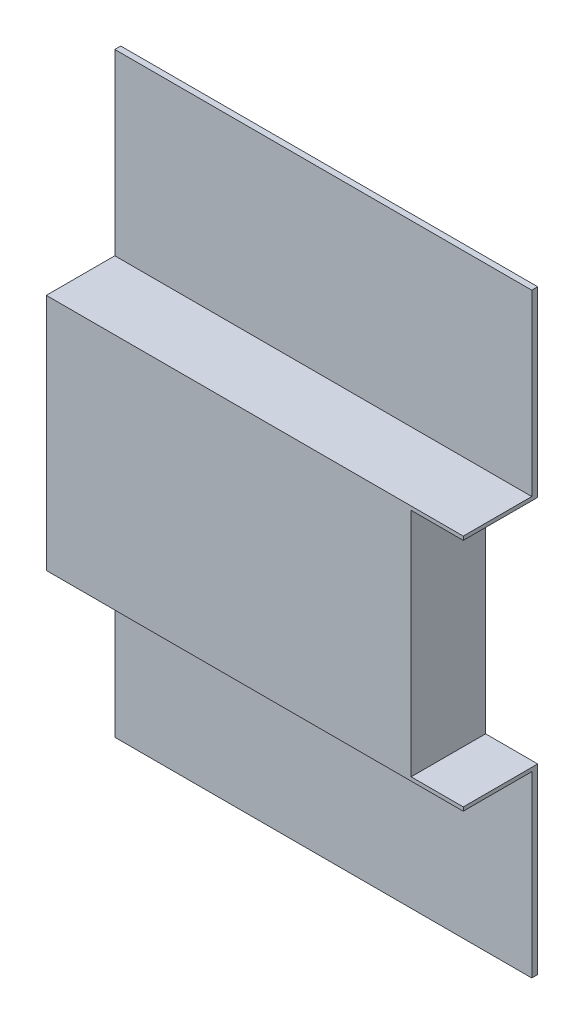
ISO-10303-21;
HEADER;
FILE_DESCRIPTION(('STEP AP214'),'2;1');
FILE_NAME('part.step','',(''),(''),'','','');
FILE_SCHEMA(('AUTOMOTIVE_DESIGN { 1 0 10303 214 1 1 1 1 }'));
ENDSEC;
DATA;
#1=APPLICATION_CONTEXT('core data for automotive mechanical design processes');
#2=APPLICATION_PROTOCOL_DEFINITION('international standard','automotive_design',2000,#1);
#3=PRODUCT_CONTEXT('',#1,'mechanical');
#4=PRODUCT('Part','Part','',(#3));
#5=PRODUCT_RELATED_PRODUCT_CATEGORY('part','',(#4));
#6=PRODUCT_DEFINITION_FORMATION('','',#4);
#7=PRODUCT_DEFINITION_CONTEXT('part definition',#1,'design');
#8=PRODUCT_DEFINITION('design','',#6,#7);
#9=PRODUCT_DEFINITION_SHAPE('','',#8);
#10=(LENGTH_UNIT() NAMED_UNIT(*) SI_UNIT(.MILLI.,.METRE.));
#11=(NAMED_UNIT(*) PLANE_ANGLE_UNIT() SI_UNIT($,.RADIAN.));
#12=(NAMED_UNIT(*) SI_UNIT($,.STERADIAN.) SOLID_ANGLE_UNIT());
#13=UNCERTAINTY_MEASURE_WITH_UNIT(LENGTH_MEASURE(1.E-05),#10,'distance_accuracy_value','');
#14=(GEOMETRIC_REPRESENTATION_CONTEXT(3) GLOBAL_UNCERTAINTY_ASSIGNED_CONTEXT((#13)) GLOBAL_UNIT_ASSIGNED_CONTEXT((#10,
#11,#12)) REPRESENTATION_CONTEXT('',''));
#15=CARTESIAN_POINT('',(0.,0.,0.));
#16=DIRECTION('',(0.,0.,1.));
#17=DIRECTION('',(1.,0.,0.));
#18=AXIS2_PLACEMENT_3D('',#15,#16,#17);
#19=CARTESIAN_POINT('',(2.65,0.4,0.25));
#20=DIRECTION('',(0.,1.,0.));
#21=DIRECTION('',(0.,0.,1.));
#22=AXIS2_PLACEMENT_3D('',#19,#20,#21);
#23=PLANE('',#22);
#24=DIRECTION('',(0.,0.,1.));
#25=VECTOR('',#24,1.);
#26=CARTESIAN_POINT('',(2.6,0.4,0.25));
#27=LINE('',#26,#25);
#28=CARTESIAN_POINT('',(2.6,0.4000000015625,0.25));
#29=VERTEX_POINT('',#28);
#30=CARTESIAN_POINT('',(2.6,0.4,0.01999998645267));
#31=VERTEX_POINT('',#30);
#32=EDGE_CURVE('E116',#29,#31,#27,.F.);
#33=ORIENTED_EDGE('',*,*,#32,.T.);
#34=DIRECTION('',(1.,0.,0.));
#35=VECTOR('',#34,1.);
#36=CARTESIAN_POINT('',(0.,0.4,0.0199999958276701));
#37=LINE('',#36,#35);
#38=CARTESIAN_POINT('',(1.2,0.4,0.01999998957767));
#39=VERTEX_POINT('',#38);
#40=EDGE_CURVE('E121',#31,#39,#37,.F.);
#41=ORIENTED_EDGE('',*,*,#40,.T.);
#42=DIRECTION('',(0.,0.,1.));
#43=VECTOR('',#42,1.);
#44=CARTESIAN_POINT('',(1.2,0.4,0.25));
#45=LINE('',#44,#43);
#46=CARTESIAN_POINT('',(1.2,0.4000000015625,0.25));
#47=VERTEX_POINT('',#46);
#48=EDGE_CURVE('E20',#39,#47,#45,.T.);
#49=ORIENTED_EDGE('',*,*,#48,.T.);
#50=DIRECTION('',(1.,0.,0.));
#51=VECTOR('',#50,1.);
#52=CARTESIAN_POINT('',(2.6,0.40000000625,0.25));
#53=LINE('',#52,#51);
#54=EDGE_CURVE('E138',#29,#47,#53,.F.);
#55=ORIENTED_EDGE('',*,*,#54,.F.);
#56=EDGE_LOOP('',(#33,#41,#49,#55));
#57=FACE_BOUND('',#56,.T.);
#58=ADVANCED_FACE('F17',(#57),#23,.T.);
#59=CARTESIAN_POINT('',(2.65,-0.4,0.25));
#60=DIRECTION('',(0.,1.,0.));
#61=DIRECTION('',(0.,0.,1.));
#62=AXIS2_PLACEMENT_3D('',#59,#60,#61);
#63=PLANE('',#62);
#64=DIRECTION('',(1.,0.,0.));
#65=VECTOR('',#64,1.);
#66=CARTESIAN_POINT('',(-2.65,-0.4,0.0199999958276798));
#67=LINE('',#66,#65);
#68=CARTESIAN_POINT('',(1.2,-0.4,0.01999999895268));
#69=VERTEX_POINT('',#68);
#70=CARTESIAN_POINT('',(2.6,-0.4,0.01999999582768));
#71=VERTEX_POINT('',#70);
#72=EDGE_CURVE('E125',#69,#71,#67,.T.);
#73=ORIENTED_EDGE('',*,*,#72,.T.);
#74=DIRECTION('',(0.,0.,1.));
#75=VECTOR('',#74,1.);
#76=CARTESIAN_POINT('',(2.6,-0.4,0.25));
#77=LINE('',#76,#75);
#78=CARTESIAN_POINT('',(2.6,-0.4,0.25));
#79=VERTEX_POINT('',#78);
#80=EDGE_CURVE('E101',#79,#71,#77,.F.);
#81=ORIENTED_EDGE('',*,*,#80,.F.);
#82=DIRECTION('',(1.,0.,0.));
#83=VECTOR('',#82,1.);
#84=CARTESIAN_POINT('',(2.6,-0.4,0.25));
#85=LINE('',#84,#83);
#86=CARTESIAN_POINT('',(1.2,-0.4,0.25));
#87=VERTEX_POINT('',#86);
#88=EDGE_CURVE('E140',#87,#79,#85,.T.);
#89=ORIENTED_EDGE('',*,*,#88,.F.);
#90=DIRECTION('',(0.,0.,1.));
#91=VECTOR('',#90,1.);
#92=CARTESIAN_POINT('',(1.2,-0.4,0.25));
#93=LINE('',#92,#91);
#94=EDGE_CURVE('E127',#69,#87,#93,.T.);
#95=ORIENTED_EDGE('',*,*,#94,.F.);
#96=EDGE_LOOP('',(#73,#81,#89,#95));
#97=FACE_BOUND('',#96,.T.);
#98=ADVANCED_FACE('F258',(#97),#63,.F.);
#99=CARTESIAN_POINT('',(0.,0.7,0.01999999582767));
#100=DIRECTION('',(0.,0.,-1.));
#101=DIRECTION('',(0.,1.,0.));
#102=AXIS2_PLACEMENT_3D('',#99,#100,#101);
#103=PLANE('',#102);
#104=ORIENTED_EDGE('',*,*,#40,.F.);
#105=DIRECTION('',(0.,1.,0.));
#106=VECTOR('',#105,1.);
#107=CARTESIAN_POINT('',(2.6,1.,0.01999998332767));
#108=LINE('',#107,#106);
#109=CARTESIAN_POINT('',(2.6,1.,0.0199999911401699));
#110=VERTEX_POINT('',#109);
#111=EDGE_CURVE('E143',#110,#31,#108,.F.);
#112=ORIENTED_EDGE('',*,*,#111,.F.);
#113=DIRECTION('',(1.,0.,0.));
#114=VECTOR('',#113,1.);
#115=CARTESIAN_POINT('',(1.2,1.,0.01999998957767));
#116=LINE('',#115,#114);
#117=CARTESIAN_POINT('',(1.2,1.,0.0199999942651699));
#118=VERTEX_POINT('',#117);
#119=EDGE_CURVE('E123',#118,#110,#116,.T.);
#120=ORIENTED_EDGE('',*,*,#119,.F.);
#121=DIRECTION('',(0.,1.,0.));
#122=VECTOR('',#121,1.);
#123=CARTESIAN_POINT('',(1.2,0.7,0.01999999582767));
#124=LINE('',#123,#122);
#125=EDGE_CURVE('E108',#39,#118,#124,.T.);
#126=ORIENTED_EDGE('',*,*,#125,.F.);
#127=EDGE_LOOP('',(#104,#112,#120,#126));
#128=FACE_BOUND('',#127,.T.);
#129=ADVANCED_FACE('F119',(#128),#103,.F.);
#130=CARTESIAN_POINT('',(-2.65,-1.,0.01999999582768));
#131=DIRECTION('',(0.,0.,-1.));
#132=DIRECTION('',(0.,1.,0.));
#133=AXIS2_PLACEMENT_3D('',#130,#131,#132);
#134=PLANE('',#133);
#135=DIRECTION('',(1.,0.,0.));
#136=VECTOR('',#135,1.);
#137=CARTESIAN_POINT('',(2.6,-1.,0.02000000207768));
#138=LINE('',#137,#136);
#139=CARTESIAN_POINT('',(2.6,-1.,0.01999999739018));
#140=VERTEX_POINT('',#139);
#141=CARTESIAN_POINT('',(1.2,-1.,0.02000000051518));
#142=VERTEX_POINT('',#141);
#143=EDGE_CURVE('E157',#140,#142,#138,.F.);
#144=ORIENTED_EDGE('',*,*,#143,.F.);
#145=DIRECTION('',(0.,1.,0.));
#146=VECTOR('',#145,1.);
#147=CARTESIAN_POINT('',(2.6,-1.,0.01999999582768));
#148=LINE('',#147,#146);
#149=EDGE_CURVE('E134',#71,#140,#148,.F.);
#150=ORIENTED_EDGE('',*,*,#149,.F.);
#151=ORIENTED_EDGE('',*,*,#72,.F.);
#152=DIRECTION('',(0.,1.,0.));
#153=VECTOR('',#152,1.);
#154=CARTESIAN_POINT('',(1.2,-1.,0.02000000832768));
#155=LINE('',#154,#153);
#156=EDGE_CURVE('E151',#142,#69,#155,.T.);
#157=ORIENTED_EDGE('',*,*,#156,.F.);
#158=EDGE_LOOP('',(#144,#150,#151,#157));
#159=FACE_BOUND('',#158,.T.);
#160=ADVANCED_FACE('F252',(#159),#134,.F.);
#161=CARTESIAN_POINT('',(2.6,1.,0.25));
#162=DIRECTION('',(0.,0.,1.));
#163=DIRECTION('',(0.,-1.,0.));
#164=AXIS2_PLACEMENT_3D('',#161,#162,#163);
#165=PLANE('',#164);
#166=DIRECTION('',(0.,1.,0.));
#167=VECTOR('',#166,1.);
#168=CARTESIAN_POINT('',(2.6,-0.3875,0.25));
#169=LINE('',#168,#167);
#170=CARTESIAN_POINT('',(2.6,-0.3875,0.25));
#171=VERTEX_POINT('',#170);
#172=EDGE_CURVE('E161',#171,#79,#169,.F.);
#173=ORIENTED_EDGE('',*,*,#172,.F.);
#174=DIRECTION('',(1.,0.,0.));
#175=VECTOR('',#174,1.);
#176=CARTESIAN_POINT('',(2.425,-0.3875,0.25));
#177=LINE('',#176,#175);
#178=CARTESIAN_POINT('',(2.425,-0.3875,0.25));
#179=VERTEX_POINT('',#178);
#180=EDGE_CURVE('E167',#179,#171,#177,.T.);
#181=ORIENTED_EDGE('',*,*,#180,.F.);
#182=DIRECTION('',(0.,1.,0.));
#183=VECTOR('',#182,1.);
#184=CARTESIAN_POINT('',(2.425,0.3875,0.25));
#185=LINE('',#184,#183);
#186=CARTESIAN_POINT('',(2.425,0.3875,0.25));
#187=VERTEX_POINT('',#186);
#188=EDGE_CURVE('E172',#187,#179,#185,.F.);
#189=ORIENTED_EDGE('',*,*,#188,.F.);
#190=DIRECTION('',(1.,0.,0.));
#191=VECTOR('',#190,1.);
#192=CARTESIAN_POINT('',(2.6,0.3875,0.25));
#193=LINE('',#192,#191);
#194=CARTESIAN_POINT('',(2.6,0.3875,0.25));
#195=VERTEX_POINT('',#194);
#196=EDGE_CURVE('E136',#187,#195,#193,.T.);
#197=ORIENTED_EDGE('',*,*,#196,.T.);
#198=DIRECTION('',(0.,1.,0.));
#199=VECTOR('',#198,1.);
#200=CARTESIAN_POINT('',(2.6,1.,0.25));
#201=LINE('',#200,#199);
#202=EDGE_CURVE('E145',#29,#195,#201,.F.);
#203=ORIENTED_EDGE('',*,*,#202,.F.);
#204=ORIENTED_EDGE('',*,*,#54,.T.);
#205=DIRECTION('',(0.,1.,0.));
#206=VECTOR('',#205,1.);
#207=CARTESIAN_POINT('',(1.2,-1.,0.25));
#208=LINE('',#207,#206);
#209=EDGE_CURVE('E111',#87,#47,#208,.T.);
#210=ORIENTED_EDGE('',*,*,#209,.F.);
#211=ORIENTED_EDGE('',*,*,#88,.T.);
#212=EDGE_LOOP('',(#173,#181,#189,#197,#203,#204,#210,#211));
#213=FACE_BOUND('',#212,.T.);
#214=ADVANCED_FACE('F249',(#213),#165,.T.);
#215=CARTESIAN_POINT('',(2.6,1.,0.));
#216=DIRECTION('',(1.,0.,0.));
#217=DIRECTION('',(0.,0.,-1.));
#218=AXIS2_PLACEMENT_3D('',#215,#216,#217);
#219=PLANE('',#218);
#220=ORIENTED_EDGE('',*,*,#202,.T.);
#221=DIRECTION('',(0.,0.,-1.));
#222=VECTOR('',#221,1.);
#223=CARTESIAN_POINT('',(2.6,0.3875,0.));
#224=LINE('',#223,#222);
#225=CARTESIAN_POINT('',(2.6,0.3875,0.));
#226=VERTEX_POINT('',#225);
#227=EDGE_CURVE('E176',#226,#195,#224,.F.);
#228=ORIENTED_EDGE('',*,*,#227,.F.);
#229=DIRECTION('',(0.,-1.,0.));
#230=VECTOR('',#229,1.);
#231=CARTESIAN_POINT('',(2.6,1.,0.));
#232=LINE('',#231,#230);
#233=CARTESIAN_POINT('',(2.6,1.,0.));
#234=VERTEX_POINT('',#233);
#235=EDGE_CURVE('E179',#226,#234,#232,.F.);
#236=ORIENTED_EDGE('',*,*,#235,.T.);
#237=DIRECTION('',(0.,0.,1.));
#238=VECTOR('',#237,1.);
#239=CARTESIAN_POINT('',(2.6,1.,0.));
#240=LINE('',#239,#238);
#241=EDGE_CURVE('E149',#110,#234,#240,.F.);
#242=ORIENTED_EDGE('',*,*,#241,.F.);
#243=ORIENTED_EDGE('',*,*,#111,.T.);
#244=ORIENTED_EDGE('',*,*,#32,.F.);
#245=EDGE_LOOP('',(#220,#228,#236,#242,#243,#244));
#246=FACE_BOUND('',#245,.T.);
#247=ADVANCED_FACE('F223',(#246),#219,.T.);
#248=CARTESIAN_POINT('',(1.2,1.,0.));
#249=DIRECTION('',(0.,1.,0.));
#250=DIRECTION('',(0.,0.,1.));
#251=AXIS2_PLACEMENT_3D('',#248,#249,#250);
#252=PLANE('',#251);
#253=DIRECTION('',(1.,0.,0.));
#254=VECTOR('',#253,1.);
#255=CARTESIAN_POINT('',(2.6,1.,0.));
#256=LINE('',#255,#254);
#257=CARTESIAN_POINT('',(1.2,1.,0.));
#258=VERTEX_POINT('',#257);
#259=EDGE_CURVE('E182',#234,#258,#256,.F.);
#260=ORIENTED_EDGE('',*,*,#259,.T.);
#261=DIRECTION('',(0.,0.,1.));
#262=VECTOR('',#261,1.);
#263=CARTESIAN_POINT('',(1.2,1.,0.));
#264=LINE('',#263,#262);
#265=EDGE_CURVE('E155',#118,#258,#264,.F.);
#266=ORIENTED_EDGE('',*,*,#265,.F.);
#267=ORIENTED_EDGE('',*,*,#119,.T.);
#268=ORIENTED_EDGE('',*,*,#241,.T.);
#269=EDGE_LOOP('',(#260,#266,#267,#268));
#270=FACE_BOUND('',#269,.T.);
#271=ADVANCED_FACE('F220',(#270),#252,.T.);
#272=CARTESIAN_POINT('',(1.2,-1.,0.));
#273=DIRECTION('',(-1.,0.,0.));
#274=DIRECTION('',(0.,0.,1.));
#275=AXIS2_PLACEMENT_3D('',#272,#273,#274);
#276=PLANE('',#275);
#277=ORIENTED_EDGE('',*,*,#265,.T.);
#278=DIRECTION('',(0.,-1.,0.));
#279=VECTOR('',#278,1.);
#280=CARTESIAN_POINT('',(1.2,1.,0.));
#281=LINE('',#280,#279);
#282=CARTESIAN_POINT('',(1.2,-1.,0.));
#283=VERTEX_POINT('',#282);
#284=EDGE_CURVE('E185',#258,#283,#281,.T.);
#285=ORIENTED_EDGE('',*,*,#284,.T.);
#286=DIRECTION('',(0.,0.,-1.));
#287=VECTOR('',#286,1.);
#288=CARTESIAN_POINT('',(1.2,-1.,0.));
#289=LINE('',#288,#287);
#290=EDGE_CURVE('E159',#142,#283,#289,.T.);
#291=ORIENTED_EDGE('',*,*,#290,.F.);
#292=ORIENTED_EDGE('',*,*,#156,.T.);
#293=ORIENTED_EDGE('',*,*,#94,.T.);
#294=ORIENTED_EDGE('',*,*,#209,.T.);
#295=ORIENTED_EDGE('',*,*,#48,.F.);
#296=ORIENTED_EDGE('',*,*,#125,.T.);
#297=EDGE_LOOP('',(#277,#285,#291,#292,#293,#294,#295,#296));
#298=FACE_BOUND('',#297,.T.);
#299=ADVANCED_FACE('F107',(#298),#276,.T.);
#300=CARTESIAN_POINT('',(2.6,-1.,0.));
#301=DIRECTION('',(0.,-1.,0.));
#302=DIRECTION('',(0.,0.,-1.));
#303=AXIS2_PLACEMENT_3D('',#300,#301,#302);
#304=PLANE('',#303);
#305=DIRECTION('',(1.,0.,0.));
#306=VECTOR('',#305,1.);
#307=CARTESIAN_POINT('',(2.6,-1.,0.));
#308=LINE('',#307,#306);
#309=CARTESIAN_POINT('',(2.6,-1.,0.));
#310=VERTEX_POINT('',#309);
#311=EDGE_CURVE('E188',#283,#310,#308,.T.);
#312=ORIENTED_EDGE('',*,*,#311,.T.);
#313=DIRECTION('',(0.,0.,-1.));
#314=VECTOR('',#313,1.);
#315=CARTESIAN_POINT('',(2.6,-1.,0.));
#316=LINE('',#315,#314);
#317=EDGE_CURVE('E163',#140,#310,#316,.T.);
#318=ORIENTED_EDGE('',*,*,#317,.F.);
#319=ORIENTED_EDGE('',*,*,#143,.T.);
#320=ORIENTED_EDGE('',*,*,#290,.T.);
#321=EDGE_LOOP('',(#312,#318,#319,#320));
#322=FACE_BOUND('',#321,.T.);
#323=ADVANCED_FACE('F214',(#322),#304,.T.);
#324=CARTESIAN_POINT('',(2.6,-0.3875,0.));
#325=DIRECTION('',(1.,0.,0.));
#326=DIRECTION('',(0.,0.,-1.));
#327=AXIS2_PLACEMENT_3D('',#324,#325,#326);
#328=PLANE('',#327);
#329=ORIENTED_EDGE('',*,*,#317,.T.);
#330=DIRECTION('',(0.,-1.,0.));
#331=VECTOR('',#330,1.);
#332=CARTESIAN_POINT('',(2.6,1.,0.));
#333=LINE('',#332,#331);
#334=CARTESIAN_POINT('',(2.6,-0.3875,0.));
#335=VERTEX_POINT('',#334);
#336=EDGE_CURVE('E191',#310,#335,#333,.F.);
#337=ORIENTED_EDGE('',*,*,#336,.T.);
#338=DIRECTION('',(0.,0.,1.));
#339=VECTOR('',#338,1.);
#340=CARTESIAN_POINT('',(2.6,-0.3875,0.));
#341=LINE('',#340,#339);
#342=EDGE_CURVE('E165',#171,#335,#341,.F.);
#343=ORIENTED_EDGE('',*,*,#342,.F.);
#344=ORIENTED_EDGE('',*,*,#172,.T.);
#345=ORIENTED_EDGE('',*,*,#80,.T.);
#346=ORIENTED_EDGE('',*,*,#149,.T.);
#347=EDGE_LOOP('',(#329,#337,#343,#344,#345,#346));
#348=FACE_BOUND('',#347,.T.);
#349=ADVANCED_FACE('F209',(#348),#328,.T.);
#350=CARTESIAN_POINT('',(2.425,-0.3875,0.));
#351=DIRECTION('',(0.,1.,0.));
#352=DIRECTION('',(0.,0.,1.));
#353=AXIS2_PLACEMENT_3D('',#350,#351,#352);
#354=PLANE('',#353);
#355=DIRECTION('',(0.,0.,-1.));
#356=VECTOR('',#355,1.);
#357=CARTESIAN_POINT('',(2.425,-0.3875,0.));
#358=LINE('',#357,#356);
#359=CARTESIAN_POINT('',(2.425,-0.3875,0.));
#360=VERTEX_POINT('',#359);
#361=EDGE_CURVE('E170',#179,#360,#358,.T.);
#362=ORIENTED_EDGE('',*,*,#361,.F.);
#363=ORIENTED_EDGE('',*,*,#180,.T.);
#364=ORIENTED_EDGE('',*,*,#342,.T.);
#365=DIRECTION('',(1.,0.,0.));
#366=VECTOR('',#365,1.);
#367=CARTESIAN_POINT('',(2.6,-0.3875,0.));
#368=LINE('',#367,#366);
#369=EDGE_CURVE('E194',#335,#360,#368,.F.);
#370=ORIENTED_EDGE('',*,*,#369,.T.);
#371=EDGE_LOOP('',(#362,#363,#364,#370));
#372=FACE_BOUND('',#371,.T.);
#373=ADVANCED_FACE('F207',(#372),#354,.T.);
#374=CARTESIAN_POINT('',(2.425,0.3875,0.));
#375=DIRECTION('',(1.,0.,0.));
#376=DIRECTION('',(0.,0.,-1.));
#377=AXIS2_PLACEMENT_3D('',#374,#375,#376);
#378=PLANE('',#377);
#379=DIRECTION('',(0.,0.,-1.));
#380=VECTOR('',#379,1.);
#381=CARTESIAN_POINT('',(2.425,0.3875,0.));
#382=LINE('',#381,#380);
#383=CARTESIAN_POINT('',(2.425,0.3875,0.));
#384=VERTEX_POINT('',#383);
#385=EDGE_CURVE('E34',#187,#384,#382,.T.);
#386=ORIENTED_EDGE('',*,*,#385,.F.);
#387=ORIENTED_EDGE('',*,*,#188,.T.);
#388=ORIENTED_EDGE('',*,*,#361,.T.);
#389=DIRECTION('',(0.,-1.,0.));
#390=VECTOR('',#389,1.);
#391=CARTESIAN_POINT('',(2.425,1.,0.));
#392=LINE('',#391,#390);
#393=EDGE_CURVE('E26',#360,#384,#392,.F.);
#394=ORIENTED_EDGE('',*,*,#393,.T.);
#395=EDGE_LOOP('',(#386,#387,#388,#394));
#396=FACE_BOUND('',#395,.T.);
#397=ADVANCED_FACE('F200',(#396),#378,.T.);
#398=CARTESIAN_POINT('',(2.6,0.3875,0.));
#399=DIRECTION('',(0.,-1.,0.));
#400=DIRECTION('',(0.,0.,-1.));
#401=AXIS2_PLACEMENT_3D('',#398,#399,#400);
#402=PLANE('',#401);
#403=ORIENTED_EDGE('',*,*,#227,.T.);
#404=ORIENTED_EDGE('',*,*,#196,.F.);
#405=ORIENTED_EDGE('',*,*,#385,.T.);
#406=DIRECTION('',(1.,0.,0.));
#407=VECTOR('',#406,1.);
#408=CARTESIAN_POINT('',(2.6,0.3875,0.));
#409=LINE('',#408,#407);
#410=EDGE_CURVE('E11',#384,#226,#409,.T.);
#411=ORIENTED_EDGE('',*,*,#410,.T.);
#412=EDGE_LOOP('',(#403,#404,#405,#411));
#413=FACE_BOUND('',#412,.T.);
#414=ADVANCED_FACE('F226',(#413),#402,.T.);
#415=CARTESIAN_POINT('',(2.6,1.,0.));
#416=DIRECTION('',(0.,0.,1.));
#417=DIRECTION('',(0.,-1.,0.));
#418=AXIS2_PLACEMENT_3D('',#415,#416,#417);
#419=PLANE('',#418);
#420=ORIENTED_EDGE('',*,*,#393,.F.);
#421=ORIENTED_EDGE('',*,*,#369,.F.);
#422=ORIENTED_EDGE('',*,*,#336,.F.);
#423=ORIENTED_EDGE('',*,*,#311,.F.);
#424=ORIENTED_EDGE('',*,*,#284,.F.);
#425=ORIENTED_EDGE('',*,*,#259,.F.);
#426=ORIENTED_EDGE('',*,*,#235,.F.);
#427=ORIENTED_EDGE('',*,*,#410,.F.);
#428=EDGE_LOOP('',(#420,#421,#422,#423,#424,#425,#426,#427));
#429=FACE_BOUND('',#428,.T.);
#430=ADVANCED_FACE('F204',(#429),#419,.F.);
#431=CLOSED_SHELL('',(#58,#98,#129,#160,#214,#247,#271,#299,#323,#349,#373,#397,#414,#430));
#432=MANIFOLD_SOLID_BREP('B1',#431);
#433=ADVANCED_BREP_SHAPE_REPRESENTATION('',(#18,#432),#14);
#434=SHAPE_DEFINITION_REPRESENTATION(#9,#433);
ENDSEC;
END-ISO-10303-21;
